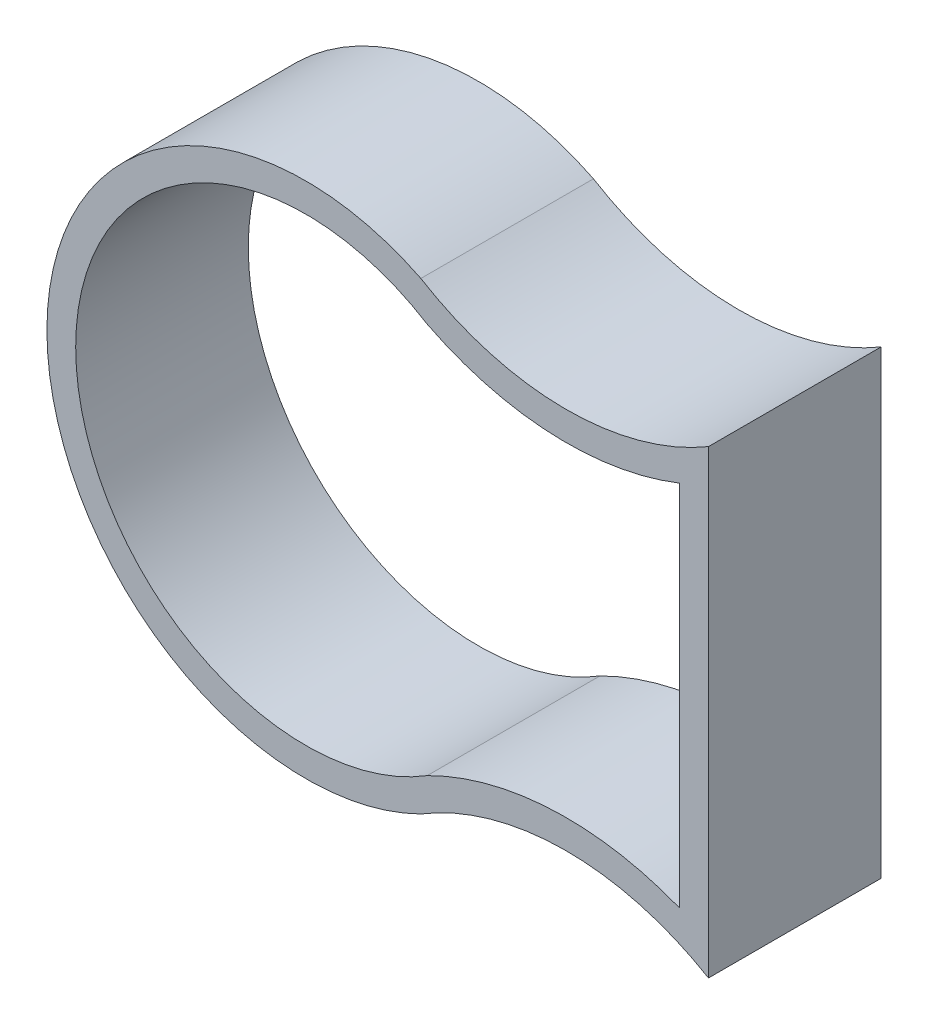
ISO-10303-21;
HEADER;
FILE_DESCRIPTION(('STEP AP214'),'2;1');
FILE_NAME('part.step','',(''),(''),'','','');
FILE_SCHEMA(('AUTOMOTIVE_DESIGN { 1 0 10303 214 1 1 1 1 }'));
ENDSEC;
DATA;
#1=APPLICATION_CONTEXT('core data for automotive mechanical design processes');
#2=APPLICATION_PROTOCOL_DEFINITION('international standard','automotive_design',2000,#1);
#3=PRODUCT_CONTEXT('',#1,'mechanical');
#4=PRODUCT('Part','Part','',(#3));
#5=PRODUCT_RELATED_PRODUCT_CATEGORY('part','',(#4));
#6=PRODUCT_DEFINITION_FORMATION('','',#4);
#7=PRODUCT_DEFINITION_CONTEXT('part definition',#1,'design');
#8=PRODUCT_DEFINITION('design','',#6,#7);
#9=PRODUCT_DEFINITION_SHAPE('','',#8);
#10=(LENGTH_UNIT() NAMED_UNIT(*) SI_UNIT(.MILLI.,.METRE.));
#11=(NAMED_UNIT(*) PLANE_ANGLE_UNIT() SI_UNIT($,.RADIAN.));
#12=(NAMED_UNIT(*) SI_UNIT($,.STERADIAN.) SOLID_ANGLE_UNIT());
#13=UNCERTAINTY_MEASURE_WITH_UNIT(LENGTH_MEASURE(1.E-05),#10,'distance_accuracy_value','');
#14=(GEOMETRIC_REPRESENTATION_CONTEXT(3) GLOBAL_UNCERTAINTY_ASSIGNED_CONTEXT((#13)) GLOBAL_UNIT_ASSIGNED_CONTEXT((#10,
#11,#12)) REPRESENTATION_CONTEXT('',''));
#15=CARTESIAN_POINT('',(0.,0.,0.));
#16=DIRECTION('',(0.,0.,1.));
#17=DIRECTION('',(1.,0.,0.));
#18=AXIS2_PLACEMENT_3D('',#15,#16,#17);
#19=CARTESIAN_POINT('',(0.,0.,38.1));
#20=DIRECTION('',(0.,0.,-1.));
#21=DIRECTION('',(-1.,0.,0.));
#22=AXIS2_PLACEMENT_3D('',#19,#20,#21);
#23=CYLINDRICAL_SURFACE('',#22,57.15);
#24=CARTESIAN_POINT('',(0.,0.,0.));
#25=DIRECTION('',(0.,0.,1.));
#26=DIRECTION('',(1.,0.,0.));
#27=AXIS2_PLACEMENT_3D('',#24,#25,#26);
#28=CIRCLE('',#27,57.15);
#29=CARTESIAN_POINT('',(25.4,51.1953367016958,0.));
#30=VERTEX_POINT('',#29);
#31=CARTESIAN_POINT('',(25.3999999999999,-51.1953367016959,0.));
#32=VERTEX_POINT('',#31);
#33=EDGE_CURVE('E157',#30,#32,#28,.T.);
#34=ORIENTED_EDGE('',*,*,#33,.T.);
#35=DIRECTION('',(0.,0.,-1.));
#36=VECTOR('',#35,1.);
#37=CARTESIAN_POINT('',(25.3999999999999,-51.1953367016959,38.1));
#38=LINE('',#37,#36);
#39=CARTESIAN_POINT('',(25.3999999999999,-51.1953367016959,38.1));
#40=VERTEX_POINT('',#39);
#41=EDGE_CURVE('E11',#40,#32,#38,.T.);
#42=ORIENTED_EDGE('',*,*,#41,.F.);
#43=CARTESIAN_POINT('',(0.,0.,38.1));
#44=DIRECTION('',(0.,0.,1.));
#45=DIRECTION('',(1.,0.,0.));
#46=AXIS2_PLACEMENT_3D('',#43,#44,#45);
#47=CIRCLE('',#46,57.15);
#48=CARTESIAN_POINT('',(25.4,51.1953367016958,38.1));
#49=VERTEX_POINT('',#48);
#50=EDGE_CURVE('E121',#49,#40,#47,.T.);
#51=ORIENTED_EDGE('',*,*,#50,.F.);
#52=DIRECTION('',(0.,0.,-1.));
#53=VECTOR('',#52,1.);
#54=CARTESIAN_POINT('',(25.4,51.1953367016958,38.1));
#55=LINE('',#54,#53);
#56=EDGE_CURVE('E61',#49,#30,#55,.T.);
#57=ORIENTED_EDGE('',*,*,#56,.T.);
#58=EDGE_LOOP('',(#34,#42,#51,#57));
#59=FACE_BOUND('',#58,.T.);
#60=ADVANCED_FACE('F41',(#59),#23,.T.);
#61=CARTESIAN_POINT('',(57.478649433239,-103.786187406015,38.1));
#62=DIRECTION('',(0.,0.,-1.));
#63=DIRECTION('',(-1.,0.,0.));
#64=AXIS2_PLACEMENT_3D('',#61,#62,#63);
#65=CYLINDRICAL_SURFACE('',#64,61.6022509918642);
#66=CARTESIAN_POINT('',(57.478649433239,-103.786187406015,0.));
#67=DIRECTION('',(0.,0.,1.));
#68=DIRECTION('',(1.,0.,0.));
#69=AXIS2_PLACEMENT_3D('',#66,#67,#68);
#70=CIRCLE('',#69,61.6022509918642);
#71=CARTESIAN_POINT('',(88.9,-50.8,0.));
#72=VERTEX_POINT('',#71);
#73=EDGE_CURVE('E128',#32,#72,#70,.F.);
#74=ORIENTED_EDGE('',*,*,#73,.T.);
#75=DIRECTION('',(0.,0.,-1.));
#76=VECTOR('',#75,1.);
#77=CARTESIAN_POINT('',(88.9,-50.8,38.1));
#78=LINE('',#77,#76);
#79=CARTESIAN_POINT('',(88.9,-50.8,38.1));
#80=VERTEX_POINT('',#79);
#81=EDGE_CURVE('E52',#80,#72,#78,.T.);
#82=ORIENTED_EDGE('',*,*,#81,.F.);
#83=CARTESIAN_POINT('',(57.478649433239,-103.786187406015,38.1));
#84=DIRECTION('',(0.,0.,1.));
#85=DIRECTION('',(1.,0.,0.));
#86=AXIS2_PLACEMENT_3D('',#83,#84,#85);
#87=CIRCLE('',#86,61.6022509918642);
#88=EDGE_CURVE('E115',#40,#80,#87,.F.);
#89=ORIENTED_EDGE('',*,*,#88,.F.);
#90=ORIENTED_EDGE('',*,*,#41,.T.);
#91=EDGE_LOOP('',(#74,#82,#89,#90));
#92=FACE_BOUND('',#91,.T.);
#93=ADVANCED_FACE('F127',(#92),#65,.F.);
#94=CARTESIAN_POINT('',(88.9,0.,38.1));
#95=DIRECTION('',(1.,0.,0.));
#96=DIRECTION('',(0.,0.,-1.));
#97=AXIS2_PLACEMENT_3D('',#94,#95,#96);
#98=PLANE('',#97);
#99=DIRECTION('',(0.,-1.,0.));
#100=VECTOR('',#99,1.);
#101=CARTESIAN_POINT('',(88.9,0.,0.));
#102=LINE('',#101,#100);
#103=CARTESIAN_POINT('',(88.9,50.8,0.));
#104=VERTEX_POINT('',#103);
#105=EDGE_CURVE('E162',#104,#72,#102,.T.);
#106=ORIENTED_EDGE('',*,*,#105,.F.);
#107=DIRECTION('',(0.,0.,-1.));
#108=VECTOR('',#107,1.);
#109=CARTESIAN_POINT('',(88.9,50.8,38.1));
#110=LINE('',#109,#108);
#111=CARTESIAN_POINT('',(88.9,50.8,38.1));
#112=VERTEX_POINT('',#111);
#113=EDGE_CURVE('E87',#112,#104,#110,.T.);
#114=ORIENTED_EDGE('',*,*,#113,.F.);
#115=DIRECTION('',(0.,-1.,0.));
#116=VECTOR('',#115,1.);
#117=CARTESIAN_POINT('',(88.9,0.,38.1));
#118=LINE('',#117,#116);
#119=EDGE_CURVE('E120',#112,#80,#118,.T.);
#120=ORIENTED_EDGE('',*,*,#119,.T.);
#121=ORIENTED_EDGE('',*,*,#81,.T.);
#122=EDGE_LOOP('',(#106,#114,#120,#121));
#123=FACE_BOUND('',#122,.T.);
#124=ADVANCED_FACE('F133',(#123),#98,.T.);
#125=CARTESIAN_POINT('',(57.478649433239,-103.786187406015,38.1));
#126=DIRECTION('',(0.,0.,-1.));
#127=DIRECTION('',(-1.,0.,0.));
#128=AXIS2_PLACEMENT_3D('',#125,#126,#127);
#129=CYLINDRICAL_SURFACE('',#128,67.9522509918642);
#130=CARTESIAN_POINT('',(57.478649433239,-103.786187406015,0.));
#131=DIRECTION('',(0.,0.,1.));
#132=DIRECTION('',(1.,0.,0.));
#133=AXIS2_PLACEMENT_3D('',#130,#131,#132);
#134=CIRCLE('',#133,67.9522509918642);
#135=CARTESIAN_POINT('',(26.8180328127659,-43.1443288979376,0.));
#136=VERTEX_POINT('',#135);
#137=CARTESIAN_POINT('',(82.55,-40.6281649890656,0.));
#138=VERTEX_POINT('',#137);
#139=EDGE_CURVE('E142',#136,#138,#134,.F.);
#140=ORIENTED_EDGE('',*,*,#139,.F.);
#141=DIRECTION('',(0.,0.,-1.));
#142=VECTOR('',#141,1.);
#143=CARTESIAN_POINT('',(26.8180328127659,-43.1443288979376,38.1));
#144=LINE('',#143,#142);
#145=CARTESIAN_POINT('',(26.8180328127659,-43.1443288979376,38.1));
#146=VERTEX_POINT('',#145);
#147=EDGE_CURVE('E45',#146,#136,#144,.T.);
#148=ORIENTED_EDGE('',*,*,#147,.F.);
#149=CARTESIAN_POINT('',(57.478649433239,-103.786187406015,38.1));
#150=DIRECTION('',(0.,0.,1.));
#151=DIRECTION('',(1.,0.,0.));
#152=AXIS2_PLACEMENT_3D('',#149,#150,#151);
#153=CIRCLE('',#152,67.9522509918642);
#154=CARTESIAN_POINT('',(82.55,-40.6281649890656,38.1));
#155=VERTEX_POINT('',#154);
#156=EDGE_CURVE('E169',#146,#155,#153,.F.);
#157=ORIENTED_EDGE('',*,*,#156,.T.);
#158=DIRECTION('',(0.,0.,-1.));
#159=VECTOR('',#158,1.);
#160=CARTESIAN_POINT('',(82.55,-40.6281649890656,38.1));
#161=LINE('',#160,#159);
#162=EDGE_CURVE('E138',#155,#138,#161,.T.);
#163=ORIENTED_EDGE('',*,*,#162,.T.);
#164=EDGE_LOOP('',(#140,#148,#157,#163));
#165=FACE_BOUND('',#164,.T.);
#166=ADVANCED_FACE('F43',(#165),#129,.T.);
#167=CARTESIAN_POINT('',(0.,0.,38.1));
#168=DIRECTION('',(0.,0.,-1.));
#169=DIRECTION('',(-1.,0.,0.));
#170=AXIS2_PLACEMENT_3D('',#167,#168,#169);
#171=CYLINDRICAL_SURFACE('',#170,50.8);
#172=CARTESIAN_POINT('',(0.,0.,0.));
#173=DIRECTION('',(0.,0.,1.));
#174=DIRECTION('',(1.,0.,0.));
#175=AXIS2_PLACEMENT_3D('',#172,#173,#174);
#176=CIRCLE('',#175,50.8);
#177=CARTESIAN_POINT('',(26.8180328127659,43.1443288979376,0.));
#178=VERTEX_POINT('',#177);
#179=EDGE_CURVE('E146',#178,#136,#176,.T.);
#180=ORIENTED_EDGE('',*,*,#179,.F.);
#181=DIRECTION('',(0.,0.,-1.));
#182=VECTOR('',#181,1.);
#183=CARTESIAN_POINT('',(26.8180328127659,43.1443288979376,38.1));
#184=LINE('',#183,#182);
#185=CARTESIAN_POINT('',(26.8180328127659,43.1443288979376,38.1));
#186=VERTEX_POINT('',#185);
#187=EDGE_CURVE('E179',#186,#178,#184,.T.);
#188=ORIENTED_EDGE('',*,*,#187,.F.);
#189=CARTESIAN_POINT('',(0.,0.,38.1));
#190=DIRECTION('',(0.,0.,1.));
#191=DIRECTION('',(1.,0.,0.));
#192=AXIS2_PLACEMENT_3D('',#189,#190,#191);
#193=CIRCLE('',#192,50.8);
#194=EDGE_CURVE('E190',#186,#146,#193,.T.);
#195=ORIENTED_EDGE('',*,*,#194,.T.);
#196=ORIENTED_EDGE('',*,*,#147,.T.);
#197=EDGE_LOOP('',(#180,#188,#195,#196));
#198=FACE_BOUND('',#197,.T.);
#199=ADVANCED_FACE('F188',(#198),#171,.F.);
#200=CARTESIAN_POINT('',(57.478649433239,103.786187406015,38.1));
#201=DIRECTION('',(0.,0.,-1.));
#202=DIRECTION('',(-1.,0.,0.));
#203=AXIS2_PLACEMENT_3D('',#200,#201,#202);
#204=CYLINDRICAL_SURFACE('',#203,67.9522509918642);
#205=CARTESIAN_POINT('',(57.478649433239,103.786187406015,0.));
#206=DIRECTION('',(0.,0.,1.));
#207=DIRECTION('',(1.,0.,0.));
#208=AXIS2_PLACEMENT_3D('',#205,#206,#207);
#209=CIRCLE('',#208,67.9522509918642);
#210=CARTESIAN_POINT('',(82.55,40.6281649890656,0.));
#211=VERTEX_POINT('',#210);
#212=EDGE_CURVE('E150',#178,#211,#209,.T.);
#213=ORIENTED_EDGE('',*,*,#212,.T.);
#214=DIRECTION('',(0.,0.,-1.));
#215=VECTOR('',#214,1.);
#216=CARTESIAN_POINT('',(82.55,40.6281649890656,38.1));
#217=LINE('',#216,#215);
#218=CARTESIAN_POINT('',(82.55,40.6281649890656,38.1));
#219=VERTEX_POINT('',#218);
#220=EDGE_CURVE('E176',#219,#211,#217,.T.);
#221=ORIENTED_EDGE('',*,*,#220,.F.);
#222=CARTESIAN_POINT('',(57.478649433239,103.786187406015,38.1));
#223=DIRECTION('',(0.,0.,1.));
#224=DIRECTION('',(1.,0.,0.));
#225=AXIS2_PLACEMENT_3D('',#222,#223,#224);
#226=CIRCLE('',#225,67.9522509918642);
#227=EDGE_CURVE('E204',#186,#219,#226,.T.);
#228=ORIENTED_EDGE('',*,*,#227,.F.);
#229=ORIENTED_EDGE('',*,*,#187,.T.);
#230=EDGE_LOOP('',(#213,#221,#228,#229));
#231=FACE_BOUND('',#230,.T.);
#232=ADVANCED_FACE('F197',(#231),#204,.T.);
#233=CARTESIAN_POINT('',(82.55,0.,38.1));
#234=DIRECTION('',(1.,0.,0.));
#235=DIRECTION('',(0.,0.,-1.));
#236=AXIS2_PLACEMENT_3D('',#233,#234,#235);
#237=PLANE('',#236);
#238=DIRECTION('',(0.,-1.,0.));
#239=VECTOR('',#238,1.);
#240=CARTESIAN_POINT('',(82.55,0.,0.));
#241=LINE('',#240,#239);
#242=EDGE_CURVE('E153',#211,#138,#241,.T.);
#243=ORIENTED_EDGE('',*,*,#242,.T.);
#244=ORIENTED_EDGE('',*,*,#162,.F.);
#245=DIRECTION('',(0.,-1.,0.));
#246=VECTOR('',#245,1.);
#247=CARTESIAN_POINT('',(82.55,0.,38.1));
#248=LINE('',#247,#246);
#249=EDGE_CURVE('E201',#219,#155,#248,.T.);
#250=ORIENTED_EDGE('',*,*,#249,.F.);
#251=ORIENTED_EDGE('',*,*,#220,.T.);
#252=EDGE_LOOP('',(#243,#244,#250,#251));
#253=FACE_BOUND('',#252,.T.);
#254=ADVANCED_FACE('F200',(#253),#237,.F.);
#255=CARTESIAN_POINT('',(57.478649433239,103.786187406015,38.1));
#256=DIRECTION('',(0.,0.,-1.));
#257=DIRECTION('',(-1.,0.,0.));
#258=AXIS2_PLACEMENT_3D('',#255,#256,#257);
#259=CYLINDRICAL_SURFACE('',#258,61.6022509918642);
#260=CARTESIAN_POINT('',(57.478649433239,103.786187406015,0.));
#261=DIRECTION('',(0.,0.,1.));
#262=DIRECTION('',(1.,0.,0.));
#263=AXIS2_PLACEMENT_3D('',#260,#261,#262);
#264=CIRCLE('',#263,61.6022509918642);
#265=EDGE_CURVE('E165',#30,#104,#264,.T.);
#266=ORIENTED_EDGE('',*,*,#265,.F.);
#267=ORIENTED_EDGE('',*,*,#56,.F.);
#268=CARTESIAN_POINT('',(57.478649433239,103.786187406015,38.1));
#269=DIRECTION('',(0.,0.,1.));
#270=DIRECTION('',(1.,0.,0.));
#271=AXIS2_PLACEMENT_3D('',#268,#269,#270);
#272=CIRCLE('',#271,61.6022509918642);
#273=EDGE_CURVE('E135',#49,#112,#272,.T.);
#274=ORIENTED_EDGE('',*,*,#273,.T.);
#275=ORIENTED_EDGE('',*,*,#113,.T.);
#276=EDGE_LOOP('',(#266,#267,#274,#275));
#277=FACE_BOUND('',#276,.T.);
#278=ADVANCED_FACE('F214',(#277),#259,.F.);
#279=CARTESIAN_POINT('',(0.,0.,38.1));
#280=DIRECTION('',(0.,0.,1.));
#281=DIRECTION('',(1.,0.,0.));
#282=AXIS2_PLACEMENT_3D('',#279,#280,#281);
#283=PLANE('',#282);
#284=ORIENTED_EDGE('',*,*,#156,.F.);
#285=ORIENTED_EDGE('',*,*,#194,.F.);
#286=ORIENTED_EDGE('',*,*,#227,.T.);
#287=ORIENTED_EDGE('',*,*,#249,.T.);
#288=EDGE_LOOP('',(#284,#285,#286,#287));
#289=FACE_BOUND('',#288,.T.);
#290=ORIENTED_EDGE('',*,*,#50,.T.);
#291=ORIENTED_EDGE('',*,*,#88,.T.);
#292=ORIENTED_EDGE('',*,*,#119,.F.);
#293=ORIENTED_EDGE('',*,*,#273,.F.);
#294=EDGE_LOOP('',(#290,#291,#292,#293));
#295=FACE_BOUND('',#294,.T.);
#296=ADVANCED_FACE('F117',(#289,#295),#283,.T.);
#297=CARTESIAN_POINT('',(0.,0.,0.));
#298=DIRECTION('',(0.,0.,1.));
#299=DIRECTION('',(1.,0.,0.));
#300=AXIS2_PLACEMENT_3D('',#297,#298,#299);
#301=PLANE('',#300);
#302=ORIENTED_EDGE('',*,*,#139,.T.);
#303=ORIENTED_EDGE('',*,*,#242,.F.);
#304=ORIENTED_EDGE('',*,*,#212,.F.);
#305=ORIENTED_EDGE('',*,*,#179,.T.);
#306=EDGE_LOOP('',(#302,#303,#304,#305));
#307=FACE_BOUND('',#306,.T.);
#308=ORIENTED_EDGE('',*,*,#33,.F.);
#309=ORIENTED_EDGE('',*,*,#265,.T.);
#310=ORIENTED_EDGE('',*,*,#105,.T.);
#311=ORIENTED_EDGE('',*,*,#73,.F.);
#312=EDGE_LOOP('',(#308,#309,#310,#311));
#313=FACE_BOUND('',#312,.T.);
#314=ADVANCED_FACE('F194',(#307,#313),#301,.F.);
#315=CLOSED_SHELL('',(#60,#93,#124,#166,#199,#232,#254,#278,#296,#314));
#316=MANIFOLD_SOLID_BREP('B2',#315);
#317=ADVANCED_BREP_SHAPE_REPRESENTATION('',(#18,#316),#14);
#318=SHAPE_DEFINITION_REPRESENTATION(#9,#317);
ENDSEC;
END-ISO-10303-21;
